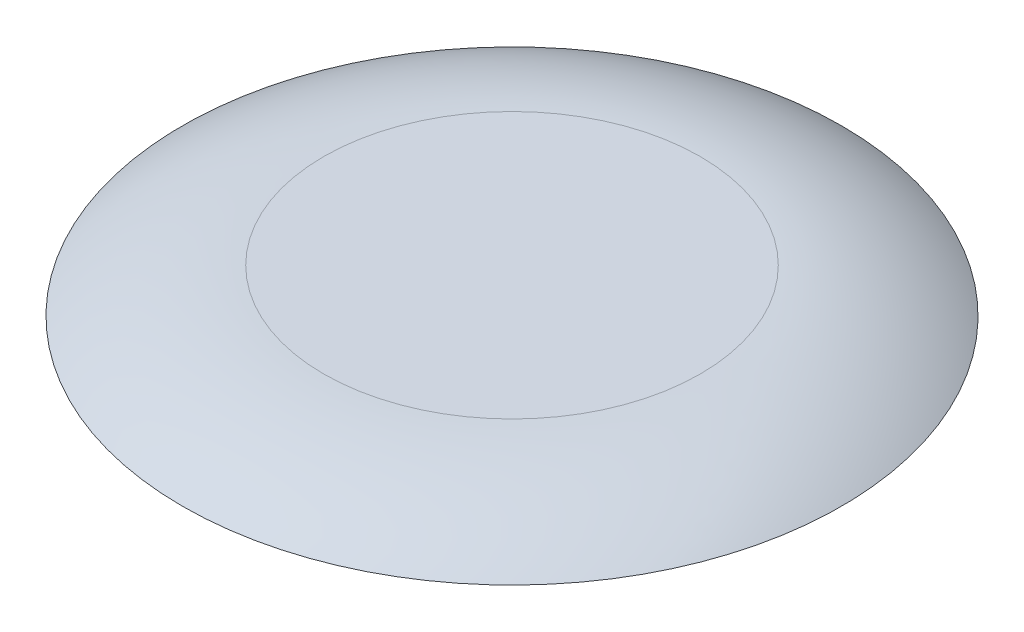
ISO-10303-21;
HEADER;
FILE_DESCRIPTION(('STEP AP214'),'2;1');
FILE_NAME('part.step','',(''),(''),'','','');
FILE_SCHEMA(('AUTOMOTIVE_DESIGN { 1 0 10303 214 1 1 1 1 }'));
ENDSEC;
DATA;
#1=APPLICATION_CONTEXT('core data for automotive mechanical design processes');
#2=APPLICATION_PROTOCOL_DEFINITION('international standard','automotive_design',2000,#1);
#3=PRODUCT_CONTEXT('',#1,'mechanical');
#4=PRODUCT('Part','Part','',(#3));
#5=PRODUCT_RELATED_PRODUCT_CATEGORY('part','',(#4));
#6=PRODUCT_DEFINITION_FORMATION('','',#4);
#7=PRODUCT_DEFINITION_CONTEXT('part definition',#1,'design');
#8=PRODUCT_DEFINITION('design','',#6,#7);
#9=PRODUCT_DEFINITION_SHAPE('','',#8);
#10=(LENGTH_UNIT() NAMED_UNIT(*) SI_UNIT(.MILLI.,.METRE.));
#11=(NAMED_UNIT(*) PLANE_ANGLE_UNIT() SI_UNIT($,.RADIAN.));
#12=(NAMED_UNIT(*) SI_UNIT($,.STERADIAN.) SOLID_ANGLE_UNIT());
#13=UNCERTAINTY_MEASURE_WITH_UNIT(LENGTH_MEASURE(1.E-05),#10,'distance_accuracy_value','');
#14=(GEOMETRIC_REPRESENTATION_CONTEXT(3) GLOBAL_UNCERTAINTY_ASSIGNED_CONTEXT((#13)) GLOBAL_UNIT_ASSIGNED_CONTEXT((#10,
#11,#12)) REPRESENTATION_CONTEXT('',''));
#15=CARTESIAN_POINT('',(0.,0.,0.));
#16=DIRECTION('',(0.,0.,1.));
#17=DIRECTION('',(1.,0.,0.));
#18=AXIS2_PLACEMENT_3D('',#15,#16,#17);
#19=CARTESIAN_POINT('',(0.,3.,0.));
#20=DIRECTION('',(0.,1.,0.));
#21=DIRECTION('',(0.,0.,1.));
#22=AXIS2_PLACEMENT_3D('',#19,#20,#21);
#23=PLANE('',#22);
#24=CARTESIAN_POINT('',(0.,3.,0.));
#25=DIRECTION('',(0.,1.,0.));
#26=DIRECTION('',(0.,0.,1.));
#27=AXIS2_PLACEMENT_3D('',#24,#25,#26);
#28=CIRCLE('',#27,12.856349239007);
#29=CARTESIAN_POINT('',(0.,3.,12.856349239007));
#30=VERTEX_POINT('',#29);
#31=EDGE_CURVE('E40',#30,#30,#28,.T.);
#32=ORIENTED_EDGE('',*,*,#31,.T.);
#33=EDGE_LOOP('',(#32));
#34=FACE_BOUND('',#33,.T.);
#35=ADVANCED_FACE('F33',(#34),#23,.T.);
#36=CARTESIAN_POINT('',(0.,-14.,0.));
#37=DIRECTION('',(0.,-1.,0.));
#38=DIRECTION('',(0.,0.,-1.));
#39=AXIS2_PLACEMENT_3D('',#36,#37,#38);
#40=DEGENERATE_TOROIDAL_SURFACE('',#39,12.856349239007,17.,.T.);
#41=CARTESIAN_POINT('',(0.,0.,0.));
#42=DIRECTION('',(0.,-1.,0.));
#43=DIRECTION('',(0.,0.,-1.));
#44=AXIS2_PLACEMENT_3D('',#41,#42,#43);
#45=CIRCLE('',#44,22.5);
#46=CARTESIAN_POINT('',(0.,0.,-22.5));
#47=VERTEX_POINT('',#46);
#48=EDGE_CURVE('E44',#47,#47,#45,.T.);
#49=ORIENTED_EDGE('',*,*,#48,.F.);
#50=EDGE_LOOP('',(#49));
#51=FACE_BOUND('',#50,.T.);
#52=ORIENTED_EDGE('',*,*,#31,.F.);
#53=EDGE_LOOP('',(#52));
#54=FACE_BOUND('',#53,.T.);
#55=ADVANCED_FACE('F53',(#51,#54),#40,.T.);
#56=CARTESIAN_POINT('',(0.,-3.,0.));
#57=DIRECTION('',(0.,-1.,0.));
#58=DIRECTION('',(0.,0.,-1.));
#59=AXIS2_PLACEMENT_3D('',#56,#57,#58);
#60=PLANE('',#59);
#61=CARTESIAN_POINT('',(0.,-3.,0.));
#62=DIRECTION('',(0.,-1.,0.));
#63=DIRECTION('',(0.,0.,-1.));
#64=AXIS2_PLACEMENT_3D('',#61,#62,#63);
#65=CIRCLE('',#64,12.856349239007);
#66=CARTESIAN_POINT('',(0.,-3.,-12.856349239007));
#67=VERTEX_POINT('',#66);
#68=EDGE_CURVE('E10',#67,#67,#65,.T.);
#69=ORIENTED_EDGE('',*,*,#68,.T.);
#70=EDGE_LOOP('',(#69));
#71=FACE_BOUND('',#70,.T.);
#72=ADVANCED_FACE('F56',(#71),#60,.T.);
#73=CARTESIAN_POINT('',(0.,14.,0.));
#74=DIRECTION('',(0.,1.,0.));
#75=DIRECTION('',(0.,0.,1.));
#76=AXIS2_PLACEMENT_3D('',#73,#74,#75);
#77=DEGENERATE_TOROIDAL_SURFACE('',#76,12.856349239007,17.,.T.);
#78=ORIENTED_EDGE('',*,*,#48,.T.);
#79=EDGE_LOOP('',(#78));
#80=FACE_BOUND('',#79,.T.);
#81=ORIENTED_EDGE('',*,*,#68,.F.);
#82=EDGE_LOOP('',(#81));
#83=FACE_BOUND('',#82,.T.);
#84=ADVANCED_FACE('F35',(#80,#83),#77,.T.);
#85=CLOSED_SHELL('',(#35,#55,#72,#84));
#86=MANIFOLD_SOLID_BREP('B2',#85);
#87=ADVANCED_BREP_SHAPE_REPRESENTATION('',(#18,#86),#14);
#88=SHAPE_DEFINITION_REPRESENTATION(#9,#87);
ENDSEC;
END-ISO-10303-21;
